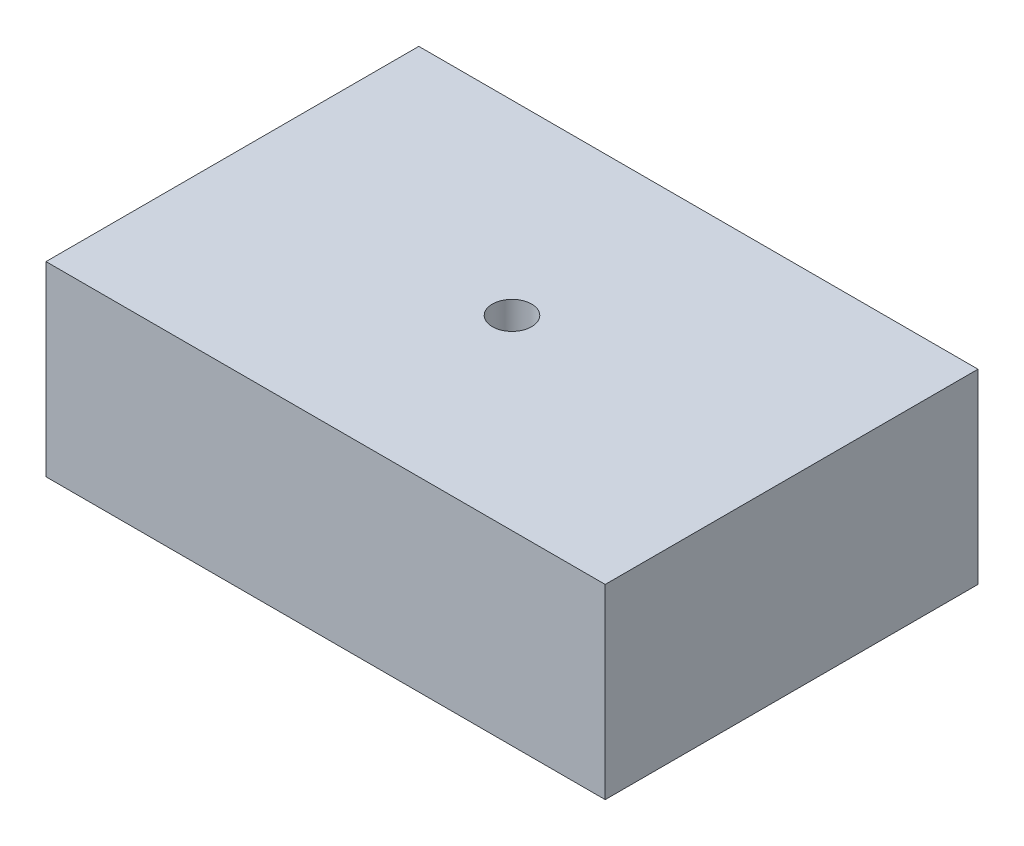
ISO-10303-21;
HEADER;
FILE_DESCRIPTION(('STEP AP214'),'2;1');
FILE_NAME('part.step','',(''),(''),'','','');
FILE_SCHEMA(('AUTOMOTIVE_DESIGN { 1 0 10303 214 1 1 1 1 }'));
ENDSEC;
DATA;
#1=APPLICATION_CONTEXT('core data for automotive mechanical design processes');
#2=APPLICATION_PROTOCOL_DEFINITION('international standard','automotive_design',2000,#1);
#3=PRODUCT_CONTEXT('',#1,'mechanical');
#4=PRODUCT('Part','Part','',(#3));
#5=PRODUCT_RELATED_PRODUCT_CATEGORY('part','',(#4));
#6=PRODUCT_DEFINITION_FORMATION('','',#4);
#7=PRODUCT_DEFINITION_CONTEXT('part definition',#1,'design');
#8=PRODUCT_DEFINITION('design','',#6,#7);
#9=PRODUCT_DEFINITION_SHAPE('','',#8);
#10=(LENGTH_UNIT() NAMED_UNIT(*) SI_UNIT(.MILLI.,.METRE.));
#11=(NAMED_UNIT(*) PLANE_ANGLE_UNIT() SI_UNIT($,.RADIAN.));
#12=(NAMED_UNIT(*) SI_UNIT($,.STERADIAN.) SOLID_ANGLE_UNIT());
#13=UNCERTAINTY_MEASURE_WITH_UNIT(LENGTH_MEASURE(1.E-05),#10,'distance_accuracy_value','');
#14=(GEOMETRIC_REPRESENTATION_CONTEXT(3) GLOBAL_UNCERTAINTY_ASSIGNED_CONTEXT((#13)) GLOBAL_UNIT_ASSIGNED_CONTEXT((#10,
#11,#12)) REPRESENTATION_CONTEXT('',''));
#15=CARTESIAN_POINT('',(0.,0.,0.));
#16=DIRECTION('',(0.,0.,1.));
#17=DIRECTION('',(1.,0.,0.));
#18=AXIS2_PLACEMENT_3D('',#15,#16,#17);
#19=CARTESIAN_POINT('',(0.,10.,0.));
#20=DIRECTION('',(0.,1.,0.));
#21=DIRECTION('',(0.,0.,1.));
#22=AXIS2_PLACEMENT_3D('',#19,#20,#21);
#23=PLANE('',#22);
#24=DIRECTION('',(0.,0.,-1.));
#25=VECTOR('',#24,1.);
#26=CARTESIAN_POINT('',(15.,10.,-10.));
#27=LINE('',#26,#25);
#28=CARTESIAN_POINT('',(15.,10.,10.));
#29=VERTEX_POINT('',#28);
#30=CARTESIAN_POINT('',(15.,10.,-10.));
#31=VERTEX_POINT('',#30);
#32=EDGE_CURVE('E85',#29,#31,#27,.T.);
#33=ORIENTED_EDGE('',*,*,#32,.T.);
#34=DIRECTION('',(-1.,0.,0.));
#35=VECTOR('',#34,1.);
#36=CARTESIAN_POINT('',(-15.,10.,-10.));
#37=LINE('',#36,#35);
#38=CARTESIAN_POINT('',(-15.,10.,-10.));
#39=VERTEX_POINT('',#38);
#40=EDGE_CURVE('E80',#31,#39,#37,.T.);
#41=ORIENTED_EDGE('',*,*,#40,.T.);
#42=DIRECTION('',(0.,0.,1.));
#43=VECTOR('',#42,1.);
#44=CARTESIAN_POINT('',(-15.,10.,-10.));
#45=LINE('',#44,#43);
#46=CARTESIAN_POINT('',(-15.,10.,10.));
#47=VERTEX_POINT('',#46);
#48=EDGE_CURVE('E83',#39,#47,#45,.T.);
#49=ORIENTED_EDGE('',*,*,#48,.T.);
#50=DIRECTION('',(1.,0.,0.));
#51=VECTOR('',#50,1.);
#52=CARTESIAN_POINT('',(-15.,10.,10.));
#53=LINE('',#52,#51);
#54=EDGE_CURVE('E50',#47,#29,#53,.T.);
#55=ORIENTED_EDGE('',*,*,#54,.T.);
#56=EDGE_LOOP('',(#33,#41,#49,#55));
#57=FACE_BOUND('',#56,.T.);
#58=CARTESIAN_POINT('',(0.,10.,0.));
#59=DIRECTION('',(0.,1.,0.));
#60=DIRECTION('',(0.,0.,1.));
#61=AXIS2_PLACEMENT_3D('',#58,#59,#60);
#62=CIRCLE('',#61,1.055);
#63=CARTESIAN_POINT('',(0.,10.,1.055));
#64=VERTEX_POINT('',#63);
#65=EDGE_CURVE('E100',#64,#64,#62,.T.);
#66=ORIENTED_EDGE('',*,*,#65,.F.);
#67=EDGE_LOOP('',(#66));
#68=FACE_BOUND('',#67,.T.);
#69=ADVANCED_FACE('F33',(#57,#68),#23,.T.);
#70=CARTESIAN_POINT('',(0.,0.,0.));
#71=DIRECTION('',(0.,1.,0.));
#72=DIRECTION('',(0.,0.,1.));
#73=AXIS2_PLACEMENT_3D('',#70,#71,#72);
#74=PLANE('',#73);
#75=DIRECTION('',(0.,0.,-1.));
#76=VECTOR('',#75,1.);
#77=CARTESIAN_POINT('',(15.,0.,-10.));
#78=LINE('',#77,#76);
#79=CARTESIAN_POINT('',(15.,0.,10.));
#80=VERTEX_POINT('',#79);
#81=CARTESIAN_POINT('',(15.,0.,-10.));
#82=VERTEX_POINT('',#81);
#83=EDGE_CURVE('E97',#80,#82,#78,.T.);
#84=ORIENTED_EDGE('',*,*,#83,.F.);
#85=DIRECTION('',(1.,0.,0.));
#86=VECTOR('',#85,1.);
#87=CARTESIAN_POINT('',(-15.,0.,10.));
#88=LINE('',#87,#86);
#89=CARTESIAN_POINT('',(-15.,0.,10.));
#90=VERTEX_POINT('',#89);
#91=EDGE_CURVE('E73',#90,#80,#88,.T.);
#92=ORIENTED_EDGE('',*,*,#91,.F.);
#93=DIRECTION('',(0.,0.,1.));
#94=VECTOR('',#93,1.);
#95=CARTESIAN_POINT('',(-15.,0.,-10.));
#96=LINE('',#95,#94);
#97=CARTESIAN_POINT('',(-15.,0.,-10.));
#98=VERTEX_POINT('',#97);
#99=EDGE_CURVE('E67',#98,#90,#96,.T.);
#100=ORIENTED_EDGE('',*,*,#99,.F.);
#101=DIRECTION('',(-1.,0.,0.));
#102=VECTOR('',#101,1.);
#103=CARTESIAN_POINT('',(-15.,0.,-10.));
#104=LINE('',#103,#102);
#105=EDGE_CURVE('E89',#82,#98,#104,.T.);
#106=ORIENTED_EDGE('',*,*,#105,.F.);
#107=EDGE_LOOP('',(#84,#92,#100,#106));
#108=FACE_BOUND('',#107,.T.);
#109=CARTESIAN_POINT('',(0.,0.,0.));
#110=DIRECTION('',(0.,1.,0.));
#111=DIRECTION('',(0.,0.,1.));
#112=AXIS2_PLACEMENT_3D('',#109,#110,#111);
#113=CIRCLE('',#112,1.055);
#114=CARTESIAN_POINT('',(0.,0.,1.055));
#115=VERTEX_POINT('',#114);
#116=EDGE_CURVE('E112',#115,#115,#113,.T.);
#117=ORIENTED_EDGE('',*,*,#116,.T.);
#118=EDGE_LOOP('',(#117));
#119=FACE_BOUND('',#118,.T.);
#120=ADVANCED_FACE('F108',(#108,#119),#74,.F.);
#121=CARTESIAN_POINT('',(15.,10.,-10.));
#122=DIRECTION('',(-1.,0.,0.));
#123=DIRECTION('',(0.,0.,1.));
#124=AXIS2_PLACEMENT_3D('',#121,#122,#123);
#125=PLANE('',#124);
#126=ORIENTED_EDGE('',*,*,#83,.T.);
#127=DIRECTION('',(0.,-1.,0.));
#128=VECTOR('',#127,1.);
#129=CARTESIAN_POINT('',(15.,10.,-10.));
#130=LINE('',#129,#128);
#131=EDGE_CURVE('E11',#31,#82,#130,.T.);
#132=ORIENTED_EDGE('',*,*,#131,.F.);
#133=ORIENTED_EDGE('',*,*,#32,.F.);
#134=DIRECTION('',(0.,-1.,0.));
#135=VECTOR('',#134,1.);
#136=CARTESIAN_POINT('',(15.,10.,10.));
#137=LINE('',#136,#135);
#138=EDGE_CURVE('E93',#29,#80,#137,.T.);
#139=ORIENTED_EDGE('',*,*,#138,.T.);
#140=EDGE_LOOP('',(#126,#132,#133,#139));
#141=FACE_BOUND('',#140,.T.);
#142=ADVANCED_FACE('F35',(#141),#125,.F.);
#143=CARTESIAN_POINT('',(-15.,10.,-10.));
#144=DIRECTION('',(0.,0.,1.));
#145=DIRECTION('',(1.,0.,0.));
#146=AXIS2_PLACEMENT_3D('',#143,#144,#145);
#147=PLANE('',#146);
#148=ORIENTED_EDGE('',*,*,#105,.T.);
#149=DIRECTION('',(0.,-1.,0.));
#150=VECTOR('',#149,1.);
#151=CARTESIAN_POINT('',(-15.,10.,-10.));
#152=LINE('',#151,#150);
#153=EDGE_CURVE('E42',#39,#98,#152,.T.);
#154=ORIENTED_EDGE('',*,*,#153,.F.);
#155=ORIENTED_EDGE('',*,*,#40,.F.);
#156=ORIENTED_EDGE('',*,*,#131,.T.);
#157=EDGE_LOOP('',(#148,#154,#155,#156));
#158=FACE_BOUND('',#157,.T.);
#159=ADVANCED_FACE('F88',(#158),#147,.F.);
#160=CARTESIAN_POINT('',(-15.,10.,-10.));
#161=DIRECTION('',(1.,0.,0.));
#162=DIRECTION('',(0.,0.,-1.));
#163=AXIS2_PLACEMENT_3D('',#160,#161,#162);
#164=PLANE('',#163);
#165=ORIENTED_EDGE('',*,*,#99,.T.);
#166=DIRECTION('',(0.,-1.,0.));
#167=VECTOR('',#166,1.);
#168=CARTESIAN_POINT('',(-15.,10.,10.));
#169=LINE('',#168,#167);
#170=EDGE_CURVE('E90',#47,#90,#169,.T.);
#171=ORIENTED_EDGE('',*,*,#170,.F.);
#172=ORIENTED_EDGE('',*,*,#48,.F.);
#173=ORIENTED_EDGE('',*,*,#153,.T.);
#174=EDGE_LOOP('',(#165,#171,#172,#173));
#175=FACE_BOUND('',#174,.T.);
#176=ADVANCED_FACE('F91',(#175),#164,.F.);
#177=CARTESIAN_POINT('',(-15.,10.,10.));
#178=DIRECTION('',(0.,0.,-1.));
#179=DIRECTION('',(-1.,0.,0.));
#180=AXIS2_PLACEMENT_3D('',#177,#178,#179);
#181=PLANE('',#180);
#182=ORIENTED_EDGE('',*,*,#91,.T.);
#183=ORIENTED_EDGE('',*,*,#138,.F.);
#184=ORIENTED_EDGE('',*,*,#54,.F.);
#185=ORIENTED_EDGE('',*,*,#170,.T.);
#186=EDGE_LOOP('',(#182,#183,#184,#185));
#187=FACE_BOUND('',#186,.T.);
#188=ADVANCED_FACE('F105',(#187),#181,.F.);
#189=CARTESIAN_POINT('',(0.,10.,0.));
#190=DIRECTION('',(0.,-1.,0.));
#191=DIRECTION('',(0.,0.,-1.));
#192=AXIS2_PLACEMENT_3D('',#189,#190,#191);
#193=CYLINDRICAL_SURFACE('',#192,1.055);
#194=ORIENTED_EDGE('',*,*,#65,.T.);
#195=EDGE_LOOP('',(#194));
#196=FACE_BOUND('',#195,.T.);
#197=ORIENTED_EDGE('',*,*,#116,.F.);
#198=EDGE_LOOP('',(#197));
#199=FACE_BOUND('',#198,.T.);
#200=ADVANCED_FACE('F118',(#196,#199),#193,.F.);
#201=CLOSED_SHELL('',(#69,#120,#142,#159,#176,#188,#200));
#202=MANIFOLD_SOLID_BREP('B2',#201);
#203=ADVANCED_BREP_SHAPE_REPRESENTATION('',(#18,#202),#14);
#204=SHAPE_DEFINITION_REPRESENTATION(#9,#203);
ENDSEC;
END-ISO-10303-21;
